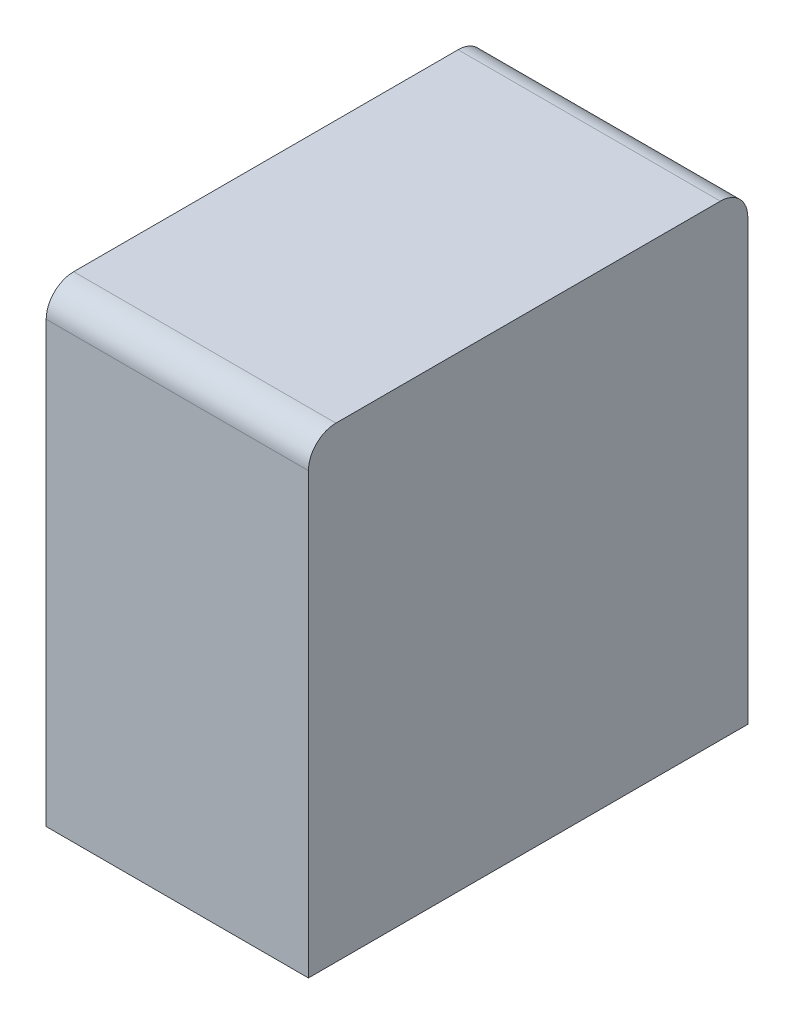
ISO-10303-21;
HEADER;
FILE_DESCRIPTION(('STEP AP214'),'2;1');
FILE_NAME('part.step','',(''),(''),'','','');
FILE_SCHEMA(('AUTOMOTIVE_DESIGN { 1 0 10303 214 1 1 1 1 }'));
ENDSEC;
DATA;
#1=APPLICATION_CONTEXT('core data for automotive mechanical design processes');
#2=APPLICATION_PROTOCOL_DEFINITION('international standard','automotive_design',2000,#1);
#3=PRODUCT_CONTEXT('',#1,'mechanical');
#4=PRODUCT('Part','Part','',(#3));
#5=PRODUCT_RELATED_PRODUCT_CATEGORY('part','',(#4));
#6=PRODUCT_DEFINITION_FORMATION('','',#4);
#7=PRODUCT_DEFINITION_CONTEXT('part definition',#1,'design');
#8=PRODUCT_DEFINITION('design','',#6,#7);
#9=PRODUCT_DEFINITION_SHAPE('','',#8);
#10=(LENGTH_UNIT() NAMED_UNIT(*) SI_UNIT(.MILLI.,.METRE.));
#11=(NAMED_UNIT(*) PLANE_ANGLE_UNIT() SI_UNIT($,.RADIAN.));
#12=(NAMED_UNIT(*) SI_UNIT($,.STERADIAN.) SOLID_ANGLE_UNIT());
#13=UNCERTAINTY_MEASURE_WITH_UNIT(LENGTH_MEASURE(1.E-05),#10,'distance_accuracy_value','');
#14=(GEOMETRIC_REPRESENTATION_CONTEXT(3) GLOBAL_UNCERTAINTY_ASSIGNED_CONTEXT((#13)) GLOBAL_UNIT_ASSIGNED_CONTEXT((#10,
#11,#12)) REPRESENTATION_CONTEXT('',''));
#15=CARTESIAN_POINT('',(0.,0.,0.));
#16=DIRECTION('',(0.,0.,1.));
#17=DIRECTION('',(1.,0.,0.));
#18=AXIS2_PLACEMENT_3D('',#15,#16,#17);
#19=CARTESIAN_POINT('',(-4.775,0.,8.));
#20=DIRECTION('',(0.,1.,0.));
#21=DIRECTION('',(0.,0.,1.));
#22=AXIS2_PLACEMENT_3D('',#19,#20,#21);
#23=PLANE('',#22);
#24=DIRECTION('',(0.,0.,1.));
#25=VECTOR('',#24,1.);
#26=CARTESIAN_POINT('',(-4.775,0.,-8.));
#27=LINE('',#26,#25);
#28=CARTESIAN_POINT('',(-4.775,0.,-8.));
#29=VERTEX_POINT('',#28);
#30=CARTESIAN_POINT('',(-4.775,0.,8.));
#31=VERTEX_POINT('',#30);
#32=EDGE_CURVE('E97',#29,#31,#27,.T.);
#33=ORIENTED_EDGE('',*,*,#32,.F.);
#34=DIRECTION('',(-1.,0.,0.));
#35=VECTOR('',#34,1.);
#36=CARTESIAN_POINT('',(-4.775,0.,-8.));
#37=LINE('',#36,#35);
#38=CARTESIAN_POINT('',(4.775,0.,-8.));
#39=VERTEX_POINT('',#38);
#40=EDGE_CURVE('E109',#39,#29,#37,.T.);
#41=ORIENTED_EDGE('',*,*,#40,.F.);
#42=DIRECTION('',(0.,0.,-1.));
#43=VECTOR('',#42,1.);
#44=CARTESIAN_POINT('',(4.775,0.,-8.));
#45=LINE('',#44,#43);
#46=CARTESIAN_POINT('',(4.775,0.,8.));
#47=VERTEX_POINT('',#46);
#48=EDGE_CURVE('E99',#47,#39,#45,.T.);
#49=ORIENTED_EDGE('',*,*,#48,.F.);
#50=DIRECTION('',(1.,0.,0.));
#51=VECTOR('',#50,1.);
#52=CARTESIAN_POINT('',(-4.775,0.,8.));
#53=LINE('',#52,#51);
#54=EDGE_CURVE('E86',#31,#47,#53,.T.);
#55=ORIENTED_EDGE('',*,*,#54,.F.);
#56=EDGE_LOOP('',(#33,#41,#49,#55));
#57=FACE_BOUND('',#56,.T.);
#58=CARTESIAN_POINT('',(-2.,0.,0.));
#59=DIRECTION('',(0.,1.,0.));
#60=DIRECTION('',(0.,0.,1.));
#61=AXIS2_PLACEMENT_3D('',#58,#59,#60);
#62=CIRCLE('',#61,0.6);
#63=CARTESIAN_POINT('',(-2.,0.,0.599999999999999));
#64=VERTEX_POINT('',#63);
#65=EDGE_CURVE('E90',#64,#64,#62,.F.);
#66=ORIENTED_EDGE('',*,*,#65,.F.);
#67=EDGE_LOOP('',(#66));
#68=FACE_BOUND('',#67,.T.);
#69=ADVANCED_FACE('F32',(#57,#68),#23,.F.);
#70=CARTESIAN_POINT('',(-4.775,17.,-8.));
#71=DIRECTION('',(1.,0.,0.));
#72=DIRECTION('',(0.,0.,-1.));
#73=AXIS2_PLACEMENT_3D('',#70,#71,#72);
#74=PLANE('',#73);
#75=DIRECTION('',(0.,-1.,0.));
#76=VECTOR('',#75,1.);
#77=CARTESIAN_POINT('',(-4.775,17.,8.));
#78=LINE('',#77,#76);
#79=CARTESIAN_POINT('',(-4.775,16.,8.));
#80=VERTEX_POINT('',#79);
#81=EDGE_CURVE('E83',#80,#31,#78,.T.);
#82=ORIENTED_EDGE('',*,*,#81,.F.);
#83=CARTESIAN_POINT('',(-4.775,16.,7.));
#84=DIRECTION('',(1.,0.,0.));
#85=DIRECTION('',(0.,0.,-1.));
#86=AXIS2_PLACEMENT_3D('',#83,#84,#85);
#87=CIRCLE('',#86,1.);
#88=CARTESIAN_POINT('',(-4.775,17.,7.));
#89=VERTEX_POINT('',#88);
#90=EDGE_CURVE('E40',#80,#89,#87,.F.);
#91=ORIENTED_EDGE('',*,*,#90,.T.);
#92=DIRECTION('',(0.,0.,1.));
#93=VECTOR('',#92,1.);
#94=CARTESIAN_POINT('',(-4.775,17.,-8.));
#95=LINE('',#94,#93);
#96=CARTESIAN_POINT('',(-4.775,17.,-7.));
#97=VERTEX_POINT('',#96);
#98=EDGE_CURVE('E111',#97,#89,#95,.T.);
#99=ORIENTED_EDGE('',*,*,#98,.F.);
#100=CARTESIAN_POINT('',(-4.775,16.,-7.));
#101=DIRECTION('',(1.,0.,0.));
#102=DIRECTION('',(0.,0.,-1.));
#103=AXIS2_PLACEMENT_3D('',#100,#101,#102);
#104=CIRCLE('',#103,1.);
#105=CARTESIAN_POINT('',(-4.775,16.,-8.));
#106=VERTEX_POINT('',#105);
#107=EDGE_CURVE('E47',#97,#106,#104,.F.);
#108=ORIENTED_EDGE('',*,*,#107,.T.);
#109=DIRECTION('',(0.,-1.,0.));
#110=VECTOR('',#109,1.);
#111=CARTESIAN_POINT('',(-4.775,17.,-8.));
#112=LINE('',#111,#110);
#113=EDGE_CURVE('E101',#106,#29,#112,.T.);
#114=ORIENTED_EDGE('',*,*,#113,.T.);
#115=ORIENTED_EDGE('',*,*,#32,.T.);
#116=EDGE_LOOP('',(#82,#91,#99,#108,#114,#115));
#117=FACE_BOUND('',#116,.T.);
#118=ADVANCED_FACE('F34',(#117),#74,.F.);
#119=CARTESIAN_POINT('',(-4.775,17.,8.));
#120=DIRECTION('',(0.,0.,-1.));
#121=DIRECTION('',(-1.,0.,0.));
#122=AXIS2_PLACEMENT_3D('',#119,#120,#121);
#123=PLANE('',#122);
#124=DIRECTION('',(0.,-1.,0.));
#125=VECTOR('',#124,1.);
#126=CARTESIAN_POINT('',(4.775,17.,8.));
#127=LINE('',#126,#125);
#128=CARTESIAN_POINT('',(4.775,16.,8.));
#129=VERTEX_POINT('',#128);
#130=EDGE_CURVE('E91',#129,#47,#127,.T.);
#131=ORIENTED_EDGE('',*,*,#130,.F.);
#132=DIRECTION('',(1.,0.,0.));
#133=VECTOR('',#132,1.);
#134=CARTESIAN_POINT('',(-4.775,16.,8.));
#135=LINE('',#134,#133);
#136=EDGE_CURVE('E55',#129,#80,#135,.F.);
#137=ORIENTED_EDGE('',*,*,#136,.T.);
#138=ORIENTED_EDGE('',*,*,#81,.T.);
#139=ORIENTED_EDGE('',*,*,#54,.T.);
#140=EDGE_LOOP('',(#131,#137,#138,#139));
#141=FACE_BOUND('',#140,.T.);
#142=ADVANCED_FACE('F85',(#141),#123,.F.);
#143=CARTESIAN_POINT('',(4.775,17.,-8.));
#144=DIRECTION('',(-1.,0.,0.));
#145=DIRECTION('',(0.,0.,1.));
#146=AXIS2_PLACEMENT_3D('',#143,#144,#145);
#147=PLANE('',#146);
#148=DIRECTION('',(0.,0.,-1.));
#149=VECTOR('',#148,1.);
#150=CARTESIAN_POINT('',(4.775,17.,-8.));
#151=LINE('',#150,#149);
#152=CARTESIAN_POINT('',(4.775,17.,7.));
#153=VERTEX_POINT('',#152);
#154=CARTESIAN_POINT('',(4.775,17.,-7.));
#155=VERTEX_POINT('',#154);
#156=EDGE_CURVE('E114',#153,#155,#151,.T.);
#157=ORIENTED_EDGE('',*,*,#156,.F.);
#158=CARTESIAN_POINT('',(4.775,16.,7.));
#159=DIRECTION('',(-1.,0.,0.));
#160=DIRECTION('',(0.,0.,1.));
#161=AXIS2_PLACEMENT_3D('',#158,#159,#160);
#162=CIRCLE('',#161,1.);
#163=EDGE_CURVE('E131',#153,#129,#162,.F.);
#164=ORIENTED_EDGE('',*,*,#163,.T.);
#165=ORIENTED_EDGE('',*,*,#130,.T.);
#166=ORIENTED_EDGE('',*,*,#48,.T.);
#167=DIRECTION('',(0.,-1.,0.));
#168=VECTOR('',#167,1.);
#169=CARTESIAN_POINT('',(4.775,17.,-8.));
#170=LINE('',#169,#168);
#171=CARTESIAN_POINT('',(4.775,16.,-8.));
#172=VERTEX_POINT('',#171);
#173=EDGE_CURVE('E118',#172,#39,#170,.T.);
#174=ORIENTED_EDGE('',*,*,#173,.F.);
#175=CARTESIAN_POINT('',(4.775,16.,-7.));
#176=DIRECTION('',(-1.,0.,0.));
#177=DIRECTION('',(0.,0.,1.));
#178=AXIS2_PLACEMENT_3D('',#175,#176,#177);
#179=CIRCLE('',#178,1.);
#180=EDGE_CURVE('E129',#172,#155,#179,.F.);
#181=ORIENTED_EDGE('',*,*,#180,.T.);
#182=EDGE_LOOP('',(#157,#164,#165,#166,#174,#181));
#183=FACE_BOUND('',#182,.T.);
#184=ADVANCED_FACE('F142',(#183),#147,.F.);
#185=CARTESIAN_POINT('',(-4.775,17.,-8.));
#186=DIRECTION('',(0.,0.,1.));
#187=DIRECTION('',(1.,0.,0.));
#188=AXIS2_PLACEMENT_3D('',#185,#186,#187);
#189=PLANE('',#188);
#190=ORIENTED_EDGE('',*,*,#113,.F.);
#191=DIRECTION('',(-1.,0.,0.));
#192=VECTOR('',#191,1.);
#193=CARTESIAN_POINT('',(4.775,16.,-8.));
#194=LINE('',#193,#192);
#195=EDGE_CURVE('E11',#106,#172,#194,.F.);
#196=ORIENTED_EDGE('',*,*,#195,.T.);
#197=ORIENTED_EDGE('',*,*,#173,.T.);
#198=ORIENTED_EDGE('',*,*,#40,.T.);
#199=EDGE_LOOP('',(#190,#196,#197,#198));
#200=FACE_BOUND('',#199,.T.);
#201=ADVANCED_FACE('F149',(#200),#189,.F.);
#202=CARTESIAN_POINT('',(-4.775,17.,8.));
#203=DIRECTION('',(0.,1.,0.));
#204=DIRECTION('',(0.,0.,1.));
#205=AXIS2_PLACEMENT_3D('',#202,#203,#204);
#206=PLANE('',#205);
#207=ORIENTED_EDGE('',*,*,#98,.T.);
#208=DIRECTION('',(1.,0.,0.));
#209=VECTOR('',#208,1.);
#210=CARTESIAN_POINT('',(4.775,17.,7.));
#211=LINE('',#210,#209);
#212=EDGE_CURVE('E126',#89,#153,#211,.T.);
#213=ORIENTED_EDGE('',*,*,#212,.T.);
#214=ORIENTED_EDGE('',*,*,#156,.T.);
#215=DIRECTION('',(-1.,0.,0.));
#216=VECTOR('',#215,1.);
#217=CARTESIAN_POINT('',(-4.775,17.,-7.));
#218=LINE('',#217,#216);
#219=EDGE_CURVE('E123',#155,#97,#218,.T.);
#220=ORIENTED_EDGE('',*,*,#219,.T.);
#221=EDGE_LOOP('',(#207,#213,#214,#220));
#222=FACE_BOUND('',#221,.T.);
#223=ADVANCED_FACE('F137',(#222),#206,.T.);
#224=CARTESIAN_POINT('',(-2.,-4.,0.));
#225=DIRECTION('',(0.,1.,0.));
#226=DIRECTION('',(0.,0.,1.));
#227=AXIS2_PLACEMENT_3D('',#224,#225,#226);
#228=CYLINDRICAL_SURFACE('',#227,0.6);
#229=CARTESIAN_POINT('',(-2.,-4.,0.));
#230=DIRECTION('',(0.,-1.,0.));
#231=DIRECTION('',(0.,0.,-1.));
#232=AXIS2_PLACEMENT_3D('',#229,#230,#231);
#233=CIRCLE('',#232,0.6);
#234=CARTESIAN_POINT('',(-2.,-4.,-0.6));
#235=VERTEX_POINT('',#234);
#236=EDGE_CURVE('E103',#235,#235,#233,.T.);
#237=ORIENTED_EDGE('',*,*,#236,.F.);
#238=EDGE_LOOP('',(#237));
#239=FACE_BOUND('',#238,.T.);
#240=ORIENTED_EDGE('',*,*,#65,.T.);
#241=EDGE_LOOP('',(#240));
#242=FACE_BOUND('',#241,.T.);
#243=ADVANCED_FACE('F156',(#239,#242),#228,.T.);
#244=CARTESIAN_POINT('',(-2.,-4.,0.));
#245=DIRECTION('',(0.,-1.,0.));
#246=DIRECTION('',(0.,0.,-1.));
#247=AXIS2_PLACEMENT_3D('',#244,#245,#246);
#248=PLANE('',#247);
#249=ORIENTED_EDGE('',*,*,#236,.T.);
#250=EDGE_LOOP('',(#249));
#251=FACE_BOUND('',#250,.T.);
#252=ADVANCED_FACE('F167',(#251),#248,.T.);
#253=CARTESIAN_POINT('',(-4.775,16.,7.));
#254=DIRECTION('',(-1.,0.,0.));
#255=DIRECTION('',(0.,0.,1.));
#256=AXIS2_PLACEMENT_3D('',#253,#254,#255);
#257=CYLINDRICAL_SURFACE('',#256,1.);
#258=ORIENTED_EDGE('',*,*,#90,.F.);
#259=ORIENTED_EDGE('',*,*,#136,.F.);
#260=ORIENTED_EDGE('',*,*,#163,.F.);
#261=ORIENTED_EDGE('',*,*,#212,.F.);
#262=EDGE_LOOP('',(#258,#259,#260,#261));
#263=FACE_BOUND('',#262,.T.);
#264=ADVANCED_FACE('F140',(#263),#257,.T.);
#265=CARTESIAN_POINT('',(-4.775,16.,-7.));
#266=DIRECTION('',(1.,0.,0.));
#267=DIRECTION('',(0.,0.,-1.));
#268=AXIS2_PLACEMENT_3D('',#265,#266,#267);
#269=CYLINDRICAL_SURFACE('',#268,1.);
#270=ORIENTED_EDGE('',*,*,#180,.F.);
#271=ORIENTED_EDGE('',*,*,#195,.F.);
#272=ORIENTED_EDGE('',*,*,#107,.F.);
#273=ORIENTED_EDGE('',*,*,#219,.F.);
#274=EDGE_LOOP('',(#270,#271,#272,#273));
#275=FACE_BOUND('',#274,.T.);
#276=ADVANCED_FACE('F146',(#275),#269,.T.);
#277=CLOSED_SHELL('',(#69,#118,#142,#184,#201,#223,#243,#252,#264,#276));
#278=MANIFOLD_SOLID_BREP('B2',#277);
#279=ADVANCED_BREP_SHAPE_REPRESENTATION('',(#18,#278),#14);
#280=SHAPE_DEFINITION_REPRESENTATION(#9,#279);
ENDSEC;
END-ISO-10303-21;
